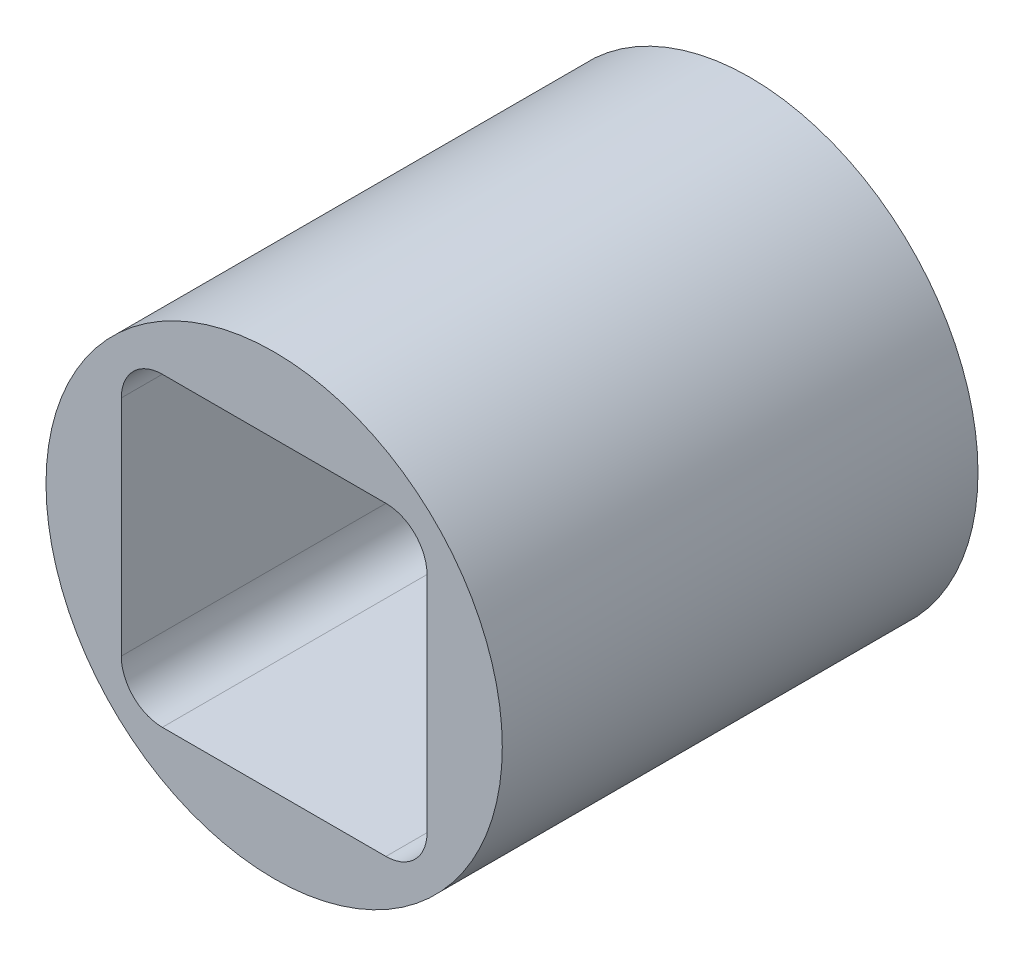
ISO-10303-21;
HEADER;
FILE_DESCRIPTION(('STEP AP214'),'2;1');
FILE_NAME('part.step','',(''),(''),'','','');
FILE_SCHEMA(('AUTOMOTIVE_DESIGN { 1 0 10303 214 1 1 1 1 }'));
ENDSEC;
DATA;
#1=APPLICATION_CONTEXT('core data for automotive mechanical design processes');
#2=APPLICATION_PROTOCOL_DEFINITION('international standard','automotive_design',2000,#1);
#3=PRODUCT_CONTEXT('',#1,'mechanical');
#4=PRODUCT('Part','Part','',(#3));
#5=PRODUCT_RELATED_PRODUCT_CATEGORY('part','',(#4));
#6=PRODUCT_DEFINITION_FORMATION('','',#4);
#7=PRODUCT_DEFINITION_CONTEXT('part definition',#1,'design');
#8=PRODUCT_DEFINITION('design','',#6,#7);
#9=PRODUCT_DEFINITION_SHAPE('','',#8);
#10=(LENGTH_UNIT() NAMED_UNIT(*) SI_UNIT(.MILLI.,.METRE.));
#11=(NAMED_UNIT(*) PLANE_ANGLE_UNIT() SI_UNIT($,.RADIAN.));
#12=(NAMED_UNIT(*) SI_UNIT($,.STERADIAN.) SOLID_ANGLE_UNIT());
#13=UNCERTAINTY_MEASURE_WITH_UNIT(LENGTH_MEASURE(1.E-05),#10,'distance_accuracy_value','');
#14=(GEOMETRIC_REPRESENTATION_CONTEXT(3) GLOBAL_UNCERTAINTY_ASSIGNED_CONTEXT((#13)) GLOBAL_UNIT_ASSIGNED_CONTEXT((#10,
#11,#12)) REPRESENTATION_CONTEXT('',''));
#15=CARTESIAN_POINT('',(0.,0.,0.));
#16=DIRECTION('',(0.,0.,1.));
#17=DIRECTION('',(1.,0.,0.));
#18=AXIS2_PLACEMENT_3D('',#15,#16,#17);
#19=CARTESIAN_POINT('',(0.,1.6,4.9784));
#20=DIRECTION('',(0.,1.,0.));
#21=DIRECTION('',(0.,0.,1.));
#22=AXIS2_PLACEMENT_3D('',#19,#20,#21);
#23=PLANE('',#22);
#24=DIRECTION('',(1.,0.,0.));
#25=VECTOR('',#24,1.);
#26=CARTESIAN_POINT('',(0.,1.6,0.));
#27=LINE('',#26,#25);
#28=CARTESIAN_POINT('',(-1.17,1.6,0.));
#29=VERTEX_POINT('',#28);
#30=CARTESIAN_POINT('',(1.17,1.6,0.));
#31=VERTEX_POINT('',#30);
#32=EDGE_CURVE('E108',#29,#31,#27,.T.);
#33=ORIENTED_EDGE('',*,*,#32,.T.);
#34=DIRECTION('',(0.,0.,-1.));
#35=VECTOR('',#34,1.);
#36=CARTESIAN_POINT('',(1.17,1.6,4.9784));
#37=LINE('',#36,#35);
#38=CARTESIAN_POINT('',(1.17,1.6,4.9784));
#39=VERTEX_POINT('',#38);
#40=EDGE_CURVE('E54',#31,#39,#37,.F.);
#41=ORIENTED_EDGE('',*,*,#40,.T.);
#42=DIRECTION('',(1.,0.,0.));
#43=VECTOR('',#42,1.);
#44=CARTESIAN_POINT('',(0.,1.6,4.9784));
#45=LINE('',#44,#43);
#46=CARTESIAN_POINT('',(-1.17,1.6,4.9784));
#47=VERTEX_POINT('',#46);
#48=EDGE_CURVE('E179',#47,#39,#45,.T.);
#49=ORIENTED_EDGE('',*,*,#48,.F.);
#50=DIRECTION('',(0.,0.,-1.));
#51=VECTOR('',#50,1.);
#52=CARTESIAN_POINT('',(-1.17,1.6,4.9784));
#53=LINE('',#52,#51);
#54=EDGE_CURVE('E151',#47,#29,#53,.T.);
#55=ORIENTED_EDGE('',*,*,#54,.T.);
#56=EDGE_LOOP('',(#33,#41,#49,#55));
#57=FACE_BOUND('',#56,.T.);
#58=ADVANCED_FACE('F38',(#57),#23,.F.);
#59=CARTESIAN_POINT('',(1.6,0.,4.9784));
#60=DIRECTION('',(1.,0.,0.));
#61=DIRECTION('',(0.,1.,0.));
#62=AXIS2_PLACEMENT_3D('',#59,#60,#61);
#63=PLANE('',#62);
#64=DIRECTION('',(0.,-1.,0.));
#65=VECTOR('',#64,1.);
#66=CARTESIAN_POINT('',(1.6,0.,0.));
#67=LINE('',#66,#65);
#68=CARTESIAN_POINT('',(1.6,1.17,0.));
#69=VERTEX_POINT('',#68);
#70=CARTESIAN_POINT('',(1.6,-1.17,0.));
#71=VERTEX_POINT('',#70);
#72=EDGE_CURVE('E191',#69,#71,#67,.T.);
#73=ORIENTED_EDGE('',*,*,#72,.T.);
#74=DIRECTION('',(0.,0.,-1.));
#75=VECTOR('',#74,1.);
#76=CARTESIAN_POINT('',(1.6,-1.17,4.9784));
#77=LINE('',#76,#75);
#78=CARTESIAN_POINT('',(1.6,-1.17,4.9784));
#79=VERTEX_POINT('',#78);
#80=EDGE_CURVE('E148',#71,#79,#77,.F.);
#81=ORIENTED_EDGE('',*,*,#80,.T.);
#82=DIRECTION('',(0.,-1.,0.));
#83=VECTOR('',#82,1.);
#84=CARTESIAN_POINT('',(1.6,0.,4.9784));
#85=LINE('',#84,#83);
#86=CARTESIAN_POINT('',(1.6,1.17,4.9784));
#87=VERTEX_POINT('',#86);
#88=EDGE_CURVE('E177',#87,#79,#85,.T.);
#89=ORIENTED_EDGE('',*,*,#88,.F.);
#90=DIRECTION('',(0.,0.,-1.));
#91=VECTOR('',#90,1.);
#92=CARTESIAN_POINT('',(1.6,1.17,0.));
#93=LINE('',#92,#91);
#94=EDGE_CURVE('E144',#87,#69,#93,.T.);
#95=ORIENTED_EDGE('',*,*,#94,.T.);
#96=EDGE_LOOP('',(#73,#81,#89,#95));
#97=FACE_BOUND('',#96,.T.);
#98=ADVANCED_FACE('F184',(#97),#63,.F.);
#99=CARTESIAN_POINT('',(0.,-1.6,4.9784));
#100=DIRECTION('',(0.,1.,0.));
#101=DIRECTION('',(0.,0.,1.));
#102=AXIS2_PLACEMENT_3D('',#99,#100,#101);
#103=PLANE('',#102);
#104=DIRECTION('',(1.,0.,0.));
#105=VECTOR('',#104,1.);
#106=CARTESIAN_POINT('',(0.,-1.6,0.));
#107=LINE('',#106,#105);
#108=CARTESIAN_POINT('',(-1.17,-1.6,0.));
#109=VERTEX_POINT('',#108);
#110=CARTESIAN_POINT('',(1.17,-1.6,0.));
#111=VERTEX_POINT('',#110);
#112=EDGE_CURVE('E124',#109,#111,#107,.T.);
#113=ORIENTED_EDGE('',*,*,#112,.F.);
#114=DIRECTION('',(0.,0.,-1.));
#115=VECTOR('',#114,1.);
#116=CARTESIAN_POINT('',(-1.17,-1.6,4.9784));
#117=LINE('',#116,#115);
#118=CARTESIAN_POINT('',(-1.17,-1.6,4.9784));
#119=VERTEX_POINT('',#118);
#120=EDGE_CURVE('E141',#109,#119,#117,.F.);
#121=ORIENTED_EDGE('',*,*,#120,.T.);
#122=DIRECTION('',(1.,0.,0.));
#123=VECTOR('',#122,1.);
#124=CARTESIAN_POINT('',(0.,-1.6,4.9784));
#125=LINE('',#124,#123);
#126=CARTESIAN_POINT('',(1.17,-1.6,4.9784));
#127=VERTEX_POINT('',#126);
#128=EDGE_CURVE('E188',#119,#127,#125,.T.);
#129=ORIENTED_EDGE('',*,*,#128,.T.);
#130=DIRECTION('',(0.,0.,-1.));
#131=VECTOR('',#130,1.);
#132=CARTESIAN_POINT('',(1.17,-1.6,4.9784));
#133=LINE('',#132,#131);
#134=EDGE_CURVE('E131',#127,#111,#133,.T.);
#135=ORIENTED_EDGE('',*,*,#134,.T.);
#136=EDGE_LOOP('',(#113,#121,#129,#135));
#137=FACE_BOUND('',#136,.T.);
#138=ADVANCED_FACE('F203',(#137),#103,.T.);
#139=CARTESIAN_POINT('',(-1.6,0.,4.9784));
#140=DIRECTION('',(1.,0.,0.));
#141=DIRECTION('',(0.,1.,0.));
#142=AXIS2_PLACEMENT_3D('',#139,#140,#141);
#143=PLANE('',#142);
#144=DIRECTION('',(0.,-1.,0.));
#145=VECTOR('',#144,1.);
#146=CARTESIAN_POINT('',(-1.6,0.,4.9784));
#147=LINE('',#146,#145);
#148=CARTESIAN_POINT('',(-1.6,1.17,4.9784));
#149=VERTEX_POINT('',#148);
#150=CARTESIAN_POINT('',(-1.6,-1.17,4.9784));
#151=VERTEX_POINT('',#150);
#152=EDGE_CURVE('E134',#149,#151,#147,.T.);
#153=ORIENTED_EDGE('',*,*,#152,.T.);
#154=DIRECTION('',(0.,0.,-1.));
#155=VECTOR('',#154,1.);
#156=CARTESIAN_POINT('',(-1.6,-1.17,0.));
#157=LINE('',#156,#155);
#158=CARTESIAN_POINT('',(-1.6,-1.17,0.));
#159=VERTEX_POINT('',#158);
#160=EDGE_CURVE('E121',#151,#159,#157,.T.);
#161=ORIENTED_EDGE('',*,*,#160,.T.);
#162=DIRECTION('',(0.,-1.,0.));
#163=VECTOR('',#162,1.);
#164=CARTESIAN_POINT('',(-1.6,0.,0.));
#165=LINE('',#164,#163);
#166=CARTESIAN_POINT('',(-1.6,1.17,0.));
#167=VERTEX_POINT('',#166);
#168=EDGE_CURVE('E107',#167,#159,#165,.T.);
#169=ORIENTED_EDGE('',*,*,#168,.F.);
#170=DIRECTION('',(0.,0.,-1.));
#171=VECTOR('',#170,1.);
#172=CARTESIAN_POINT('',(-1.6,1.17,4.9784));
#173=LINE('',#172,#171);
#174=EDGE_CURVE('E119',#167,#149,#173,.F.);
#175=ORIENTED_EDGE('',*,*,#174,.T.);
#176=EDGE_LOOP('',(#153,#161,#169,#175));
#177=FACE_BOUND('',#176,.T.);
#178=ADVANCED_FACE('F118',(#177),#143,.T.);
#179=CARTESIAN_POINT('',(0.,0.,4.9784));
#180=DIRECTION('',(0.,0.,-1.));
#181=DIRECTION('',(-1.,0.,0.));
#182=AXIS2_PLACEMENT_3D('',#179,#180,#181);
#183=CYLINDRICAL_SURFACE('',#182,2.3876);
#184=CARTESIAN_POINT('',(0.,0.,4.9784));
#185=DIRECTION('',(0.,0.,1.));
#186=DIRECTION('',(1.,0.,0.));
#187=AXIS2_PLACEMENT_3D('',#184,#185,#186);
#188=CIRCLE('',#187,2.3876);
#189=CARTESIAN_POINT('',(2.3876,0.,4.9784));
#190=VERTEX_POINT('',#189);
#191=EDGE_CURVE('E127',#190,#190,#188,.T.);
#192=ORIENTED_EDGE('',*,*,#191,.F.);
#193=EDGE_LOOP('',(#192));
#194=FACE_BOUND('',#193,.T.);
#195=CARTESIAN_POINT('',(0.,0.,0.));
#196=DIRECTION('',(0.,0.,1.));
#197=DIRECTION('',(1.,0.,0.));
#198=AXIS2_PLACEMENT_3D('',#195,#196,#197);
#199=CIRCLE('',#198,2.3876);
#200=CARTESIAN_POINT('',(2.3876,0.,0.));
#201=VERTEX_POINT('',#200);
#202=EDGE_CURVE('E123',#201,#201,#199,.T.);
#203=ORIENTED_EDGE('',*,*,#202,.T.);
#204=EDGE_LOOP('',(#203));
#205=FACE_BOUND('',#204,.T.);
#206=ADVANCED_FACE('F219',(#194,#205),#183,.T.);
#207=CARTESIAN_POINT('',(0.,0.,4.9784));
#208=DIRECTION('',(0.,0.,1.));
#209=DIRECTION('',(1.,0.,0.));
#210=AXIS2_PLACEMENT_3D('',#207,#208,#209);
#211=PLANE('',#210);
#212=ORIENTED_EDGE('',*,*,#152,.F.);
#213=CARTESIAN_POINT('',(-1.17,1.17,4.9784));
#214=DIRECTION('',(0.,0.,1.));
#215=DIRECTION('',(1.,0.,0.));
#216=AXIS2_PLACEMENT_3D('',#213,#214,#215);
#217=CIRCLE('',#216,0.43);
#218=EDGE_CURVE('E11',#149,#47,#217,.F.);
#219=ORIENTED_EDGE('',*,*,#218,.T.);
#220=ORIENTED_EDGE('',*,*,#48,.T.);
#221=CARTESIAN_POINT('',(1.17,1.17,4.9784));
#222=DIRECTION('',(0.,0.,1.));
#223=DIRECTION('',(1.,0.,0.));
#224=AXIS2_PLACEMENT_3D('',#221,#222,#223);
#225=CIRCLE('',#224,0.43);
#226=EDGE_CURVE('E114',#39,#87,#225,.F.);
#227=ORIENTED_EDGE('',*,*,#226,.T.);
#228=ORIENTED_EDGE('',*,*,#88,.T.);
#229=CARTESIAN_POINT('',(1.17,-1.17,4.9784));
#230=DIRECTION('',(0.,0.,1.));
#231=DIRECTION('',(1.,0.,0.));
#232=AXIS2_PLACEMENT_3D('',#229,#230,#231);
#233=CIRCLE('',#232,0.43);
#234=EDGE_CURVE('E165',#79,#127,#233,.F.);
#235=ORIENTED_EDGE('',*,*,#234,.T.);
#236=ORIENTED_EDGE('',*,*,#128,.F.);
#237=CARTESIAN_POINT('',(-1.17,-1.17,4.9784));
#238=DIRECTION('',(0.,0.,1.));
#239=DIRECTION('',(1.,0.,0.));
#240=AXIS2_PLACEMENT_3D('',#237,#238,#239);
#241=CIRCLE('',#240,0.43);
#242=EDGE_CURVE('E159',#119,#151,#241,.F.);
#243=ORIENTED_EDGE('',*,*,#242,.T.);
#244=EDGE_LOOP('',(#212,#219,#220,#227,#228,#235,#236,#243));
#245=FACE_BOUND('',#244,.T.);
#246=ORIENTED_EDGE('',*,*,#191,.T.);
#247=EDGE_LOOP('',(#246));
#248=FACE_BOUND('',#247,.T.);
#249=ADVANCED_FACE('F175',(#245,#248),#211,.T.);
#250=CARTESIAN_POINT('',(0.,0.,0.));
#251=DIRECTION('',(0.,0.,1.));
#252=DIRECTION('',(1.,0.,0.));
#253=AXIS2_PLACEMENT_3D('',#250,#251,#252);
#254=PLANE('',#253);
#255=ORIENTED_EDGE('',*,*,#32,.F.);
#256=CARTESIAN_POINT('',(-1.17,1.17,0.));
#257=DIRECTION('',(0.,0.,1.));
#258=DIRECTION('',(1.,0.,0.));
#259=AXIS2_PLACEMENT_3D('',#256,#257,#258);
#260=CIRCLE('',#259,0.43);
#261=EDGE_CURVE('E47',#29,#167,#260,.T.);
#262=ORIENTED_EDGE('',*,*,#261,.T.);
#263=ORIENTED_EDGE('',*,*,#168,.T.);
#264=CARTESIAN_POINT('',(-1.17,-1.17,0.));
#265=DIRECTION('',(0.,0.,1.));
#266=DIRECTION('',(1.,0.,0.));
#267=AXIS2_PLACEMENT_3D('',#264,#265,#266);
#268=CIRCLE('',#267,0.43);
#269=EDGE_CURVE('E156',#159,#109,#268,.T.);
#270=ORIENTED_EDGE('',*,*,#269,.T.);
#271=ORIENTED_EDGE('',*,*,#112,.T.);
#272=CARTESIAN_POINT('',(1.17,-1.17,0.));
#273=DIRECTION('',(0.,0.,1.));
#274=DIRECTION('',(1.,0.,0.));
#275=AXIS2_PLACEMENT_3D('',#272,#273,#274);
#276=CIRCLE('',#275,0.43);
#277=EDGE_CURVE('E162',#111,#71,#276,.T.);
#278=ORIENTED_EDGE('',*,*,#277,.T.);
#279=ORIENTED_EDGE('',*,*,#72,.F.);
#280=CARTESIAN_POINT('',(1.17,1.17,0.));
#281=DIRECTION('',(0.,0.,1.));
#282=DIRECTION('',(1.,0.,0.));
#283=AXIS2_PLACEMENT_3D('',#280,#281,#282);
#284=CIRCLE('',#283,0.43);
#285=EDGE_CURVE('E168',#69,#31,#284,.T.);
#286=ORIENTED_EDGE('',*,*,#285,.T.);
#287=EDGE_LOOP('',(#255,#262,#263,#270,#271,#278,#279,#286));
#288=FACE_BOUND('',#287,.T.);
#289=ORIENTED_EDGE('',*,*,#202,.F.);
#290=EDGE_LOOP('',(#289));
#291=FACE_BOUND('',#290,.T.);
#292=ADVANCED_FACE('F105',(#288,#291),#254,.F.);
#293=CARTESIAN_POINT('',(-1.17,-1.17,4.9784));
#294=DIRECTION('',(0.,0.,1.));
#295=DIRECTION('',(1.,0.,0.));
#296=AXIS2_PLACEMENT_3D('',#293,#294,#295);
#297=CYLINDRICAL_SURFACE('',#296,0.43);
#298=ORIENTED_EDGE('',*,*,#242,.F.);
#299=ORIENTED_EDGE('',*,*,#120,.F.);
#300=ORIENTED_EDGE('',*,*,#269,.F.);
#301=ORIENTED_EDGE('',*,*,#160,.F.);
#302=EDGE_LOOP('',(#298,#299,#300,#301));
#303=FACE_BOUND('',#302,.T.);
#304=ADVANCED_FACE('F209',(#303),#297,.F.);
#305=CARTESIAN_POINT('',(1.17,-1.17,4.9784));
#306=DIRECTION('',(0.,0.,-1.));
#307=DIRECTION('',(-1.,0.,0.));
#308=AXIS2_PLACEMENT_3D('',#305,#306,#307);
#309=CYLINDRICAL_SURFACE('',#308,0.43);
#310=ORIENTED_EDGE('',*,*,#234,.F.);
#311=ORIENTED_EDGE('',*,*,#80,.F.);
#312=ORIENTED_EDGE('',*,*,#277,.F.);
#313=ORIENTED_EDGE('',*,*,#134,.F.);
#314=EDGE_LOOP('',(#310,#311,#312,#313));
#315=FACE_BOUND('',#314,.T.);
#316=ADVANCED_FACE('F227',(#315),#309,.F.);
#317=CARTESIAN_POINT('',(1.17,1.17,4.9784));
#318=DIRECTION('',(0.,0.,1.));
#319=DIRECTION('',(1.,0.,0.));
#320=AXIS2_PLACEMENT_3D('',#317,#318,#319);
#321=CYLINDRICAL_SURFACE('',#320,0.43);
#322=ORIENTED_EDGE('',*,*,#226,.F.);
#323=ORIENTED_EDGE('',*,*,#40,.F.);
#324=ORIENTED_EDGE('',*,*,#285,.F.);
#325=ORIENTED_EDGE('',*,*,#94,.F.);
#326=EDGE_LOOP('',(#322,#323,#324,#325));
#327=FACE_BOUND('',#326,.T.);
#328=ADVANCED_FACE('F190',(#327),#321,.F.);
#329=CARTESIAN_POINT('',(-1.17,1.17,4.9784));
#330=DIRECTION('',(0.,0.,-1.));
#331=DIRECTION('',(-1.,0.,0.));
#332=AXIS2_PLACEMENT_3D('',#329,#330,#331);
#333=CYLINDRICAL_SURFACE('',#332,0.43);
#334=ORIENTED_EDGE('',*,*,#218,.F.);
#335=ORIENTED_EDGE('',*,*,#174,.F.);
#336=ORIENTED_EDGE('',*,*,#261,.F.);
#337=ORIENTED_EDGE('',*,*,#54,.F.);
#338=EDGE_LOOP('',(#334,#335,#336,#337));
#339=FACE_BOUND('',#338,.T.);
#340=ADVANCED_FACE('F40',(#339),#333,.F.);
#341=CLOSED_SHELL('',(#58,#98,#138,#178,#206,#249,#292,#304,#316,#328,#340));
#342=MANIFOLD_SOLID_BREP('B2',#341);
#343=ADVANCED_BREP_SHAPE_REPRESENTATION('',(#18,#342),#14);
#344=SHAPE_DEFINITION_REPRESENTATION(#9,#343);
ENDSEC;
END-ISO-10303-21;
